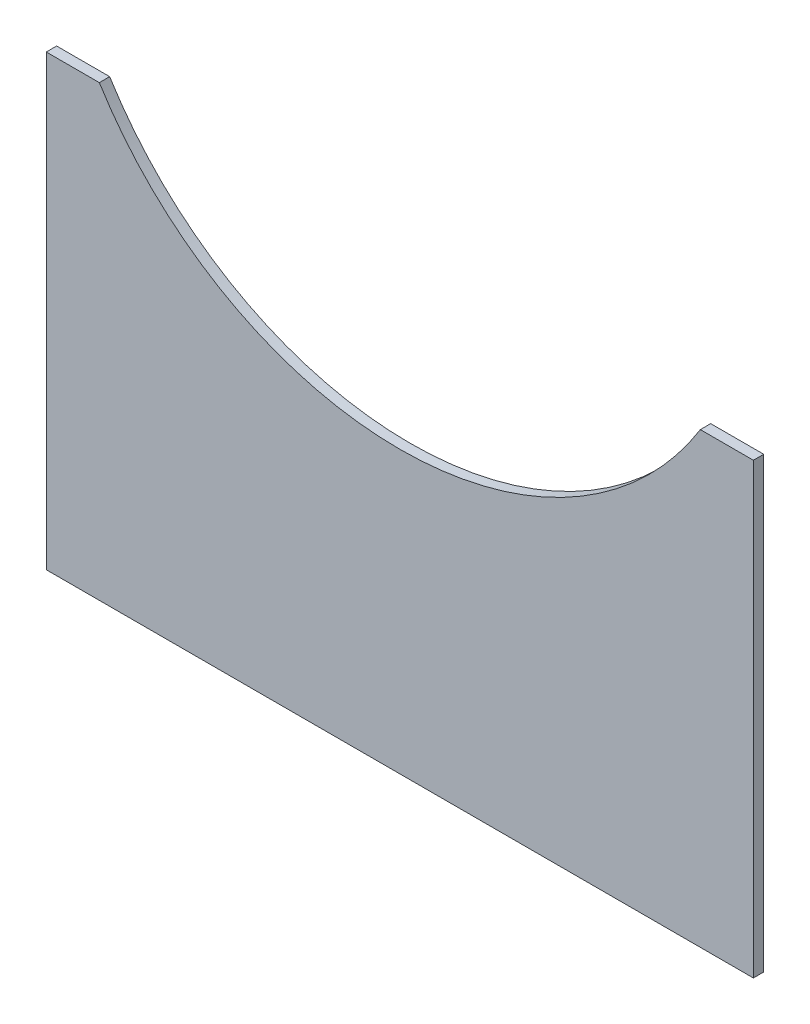
ISO-10303-21;
HEADER;
FILE_DESCRIPTION(('STEP AP214'),'2;1');
FILE_NAME('part.step','',(''),(''),'','','');
FILE_SCHEMA(('AUTOMOTIVE_DESIGN { 1 0 10303 214 1 1 1 1 }'));
ENDSEC;
DATA;
#1=APPLICATION_CONTEXT('core data for automotive mechanical design processes');
#2=APPLICATION_PROTOCOL_DEFINITION('international standard','automotive_design',2000,#1);
#3=PRODUCT_CONTEXT('',#1,'mechanical');
#4=PRODUCT('Part','Part','',(#3));
#5=PRODUCT_RELATED_PRODUCT_CATEGORY('part','',(#4));
#6=PRODUCT_DEFINITION_FORMATION('','',#4);
#7=PRODUCT_DEFINITION_CONTEXT('part definition',#1,'design');
#8=PRODUCT_DEFINITION('design','',#6,#7);
#9=PRODUCT_DEFINITION_SHAPE('','',#8);
#10=(LENGTH_UNIT() NAMED_UNIT(*) SI_UNIT(.MILLI.,.METRE.));
#11=(NAMED_UNIT(*) PLANE_ANGLE_UNIT() SI_UNIT($,.RADIAN.));
#12=(NAMED_UNIT(*) SI_UNIT($,.STERADIAN.) SOLID_ANGLE_UNIT());
#13=UNCERTAINTY_MEASURE_WITH_UNIT(LENGTH_MEASURE(1.E-05),#10,'distance_accuracy_value','');
#14=(GEOMETRIC_REPRESENTATION_CONTEXT(3) GLOBAL_UNCERTAINTY_ASSIGNED_CONTEXT((#13)) GLOBAL_UNIT_ASSIGNED_CONTEXT((#10,
#11,#12)) REPRESENTATION_CONTEXT('',''));
#15=CARTESIAN_POINT('',(0.,0.,0.));
#16=DIRECTION('',(0.,0.,1.));
#17=DIRECTION('',(1.,0.,0.));
#18=AXIS2_PLACEMENT_3D('',#15,#16,#17);
#19=CARTESIAN_POINT('',(-51.25,0.,0.75));
#20=DIRECTION('',(1.,0.,0.));
#21=DIRECTION('',(0.,0.,-1.));
#22=AXIS2_PLACEMENT_3D('',#19,#20,#21);
#23=PLANE('',#22);
#24=DIRECTION('',(0.,-1.,0.));
#25=VECTOR('',#24,1.);
#26=CARTESIAN_POINT('',(-51.25,0.,-0.75));
#27=LINE('',#26,#25);
#28=CARTESIAN_POINT('',(-51.25,65.,-0.75));
#29=VERTEX_POINT('',#28);
#30=CARTESIAN_POINT('',(-51.25,0.,-0.75));
#31=VERTEX_POINT('',#30);
#32=EDGE_CURVE('E125',#29,#31,#27,.T.);
#33=ORIENTED_EDGE('',*,*,#32,.T.);
#34=DIRECTION('',(0.,0.,-1.));
#35=VECTOR('',#34,1.);
#36=CARTESIAN_POINT('',(-51.25,0.,0.75));
#37=LINE('',#36,#35);
#38=CARTESIAN_POINT('',(-51.25,0.,0.75));
#39=VERTEX_POINT('',#38);
#40=EDGE_CURVE('E11',#39,#31,#37,.T.);
#41=ORIENTED_EDGE('',*,*,#40,.F.);
#42=DIRECTION('',(0.,-1.,0.));
#43=VECTOR('',#42,1.);
#44=CARTESIAN_POINT('',(-51.25,0.,0.75));
#45=LINE('',#44,#43);
#46=CARTESIAN_POINT('',(-51.25,65.,0.75));
#47=VERTEX_POINT('',#46);
#48=EDGE_CURVE('E137',#47,#39,#45,.T.);
#49=ORIENTED_EDGE('',*,*,#48,.F.);
#50=DIRECTION('',(0.,0.,-1.));
#51=VECTOR('',#50,1.);
#52=CARTESIAN_POINT('',(-51.25,65.,0.75));
#53=LINE('',#52,#51);
#54=EDGE_CURVE('E121',#47,#29,#53,.T.);
#55=ORIENTED_EDGE('',*,*,#54,.T.);
#56=EDGE_LOOP('',(#33,#41,#49,#55));
#57=FACE_BOUND('',#56,.T.);
#58=ADVANCED_FACE('F39',(#57),#23,.F.);
#59=CARTESIAN_POINT('',(51.25,0.,0.75));
#60=DIRECTION('',(0.,1.,0.));
#61=DIRECTION('',(0.,0.,1.));
#62=AXIS2_PLACEMENT_3D('',#59,#60,#61);
#63=PLANE('',#62);
#64=DIRECTION('',(1.,0.,0.));
#65=VECTOR('',#64,1.);
#66=CARTESIAN_POINT('',(51.25,0.,-0.75));
#67=LINE('',#66,#65);
#68=CARTESIAN_POINT('',(51.25,0.,-0.75));
#69=VERTEX_POINT('',#68);
#70=EDGE_CURVE('E128',#31,#69,#67,.T.);
#71=ORIENTED_EDGE('',*,*,#70,.T.);
#72=DIRECTION('',(0.,0.,-1.));
#73=VECTOR('',#72,1.);
#74=CARTESIAN_POINT('',(51.25,0.,0.75));
#75=LINE('',#74,#73);
#76=CARTESIAN_POINT('',(51.25,0.,0.75));
#77=VERTEX_POINT('',#76);
#78=EDGE_CURVE('E47',#77,#69,#75,.T.);
#79=ORIENTED_EDGE('',*,*,#78,.F.);
#80=DIRECTION('',(1.,0.,0.));
#81=VECTOR('',#80,1.);
#82=CARTESIAN_POINT('',(51.25,0.,0.75));
#83=LINE('',#82,#81);
#84=EDGE_CURVE('E93',#39,#77,#83,.T.);
#85=ORIENTED_EDGE('',*,*,#84,.F.);
#86=ORIENTED_EDGE('',*,*,#40,.T.);
#87=EDGE_LOOP('',(#71,#79,#85,#86));
#88=FACE_BOUND('',#87,.T.);
#89=ADVANCED_FACE('F163',(#88),#63,.F.);
#90=CARTESIAN_POINT('',(51.25,0.,0.75));
#91=DIRECTION('',(-1.,0.,0.));
#92=DIRECTION('',(0.,-1.,0.));
#93=AXIS2_PLACEMENT_3D('',#90,#91,#92);
#94=PLANE('',#93);
#95=DIRECTION('',(0.,1.,0.));
#96=VECTOR('',#95,1.);
#97=CARTESIAN_POINT('',(51.25,0.,-0.75));
#98=LINE('',#97,#96);
#99=CARTESIAN_POINT('',(51.25,65.,-0.75));
#100=VERTEX_POINT('',#99);
#101=EDGE_CURVE('E131',#69,#100,#98,.T.);
#102=ORIENTED_EDGE('',*,*,#101,.T.);
#103=DIRECTION('',(0.,0.,-1.));
#104=VECTOR('',#103,1.);
#105=CARTESIAN_POINT('',(51.25,65.,0.75));
#106=LINE('',#105,#104);
#107=CARTESIAN_POINT('',(51.25,65.,0.75));
#108=VERTEX_POINT('',#107);
#109=EDGE_CURVE('E116',#108,#100,#106,.T.);
#110=ORIENTED_EDGE('',*,*,#109,.F.);
#111=DIRECTION('',(0.,1.,0.));
#112=VECTOR('',#111,1.);
#113=CARTESIAN_POINT('',(51.25,0.,0.75));
#114=LINE('',#113,#112);
#115=EDGE_CURVE('E107',#77,#108,#114,.T.);
#116=ORIENTED_EDGE('',*,*,#115,.F.);
#117=ORIENTED_EDGE('',*,*,#78,.T.);
#118=EDGE_LOOP('',(#102,#110,#116,#117));
#119=FACE_BOUND('',#118,.T.);
#120=ADVANCED_FACE('F145',(#119),#94,.F.);
#121=CARTESIAN_POINT('',(51.25,65.,0.75));
#122=DIRECTION('',(0.,-1.,0.));
#123=DIRECTION('',(1.,0.,0.));
#124=AXIS2_PLACEMENT_3D('',#121,#122,#123);
#125=PLANE('',#124);
#126=DIRECTION('',(-1.,0.,0.));
#127=VECTOR('',#126,1.);
#128=CARTESIAN_POINT('',(51.25,65.,-0.75));
#129=LINE('',#128,#127);
#130=CARTESIAN_POINT('',(43.5610204196366,65.,-0.75));
#131=VERTEX_POINT('',#130);
#132=EDGE_CURVE('E115',#100,#131,#129,.T.);
#133=ORIENTED_EDGE('',*,*,#132,.T.);
#134=DIRECTION('',(0.,0.,-1.));
#135=VECTOR('',#134,1.);
#136=CARTESIAN_POINT('',(43.5610204196366,65.,0.75));
#137=LINE('',#136,#135);
#138=CARTESIAN_POINT('',(43.5610204196366,65.,0.75));
#139=VERTEX_POINT('',#138);
#140=EDGE_CURVE('E112',#139,#131,#137,.T.);
#141=ORIENTED_EDGE('',*,*,#140,.F.);
#142=DIRECTION('',(-1.,0.,0.));
#143=VECTOR('',#142,1.);
#144=CARTESIAN_POINT('',(51.25,65.,0.75));
#145=LINE('',#144,#143);
#146=EDGE_CURVE('E101',#108,#139,#145,.T.);
#147=ORIENTED_EDGE('',*,*,#146,.F.);
#148=ORIENTED_EDGE('',*,*,#109,.T.);
#149=EDGE_LOOP('',(#133,#141,#147,#148));
#150=FACE_BOUND('',#149,.T.);
#151=ADVANCED_FACE('F113',(#150),#125,.F.);
#152=CARTESIAN_POINT('',(0.,92.,0.75));
#153=DIRECTION('',(0.,0.,-1.));
#154=DIRECTION('',(-1.,0.,0.));
#155=AXIS2_PLACEMENT_3D('',#152,#153,#154);
#156=CYLINDRICAL_SURFACE('',#155,51.25);
#157=CARTESIAN_POINT('',(0.,92.,-0.75));
#158=DIRECTION('',(0.,0.,-1.));
#159=DIRECTION('',(1.,0.,0.));
#160=AXIS2_PLACEMENT_3D('',#157,#158,#159);
#161=CIRCLE('',#160,51.25);
#162=CARTESIAN_POINT('',(-43.5610204196366,65.,-0.75));
#163=VERTEX_POINT('',#162);
#164=EDGE_CURVE('E79',#131,#163,#161,.T.);
#165=ORIENTED_EDGE('',*,*,#164,.T.);
#166=DIRECTION('',(0.,0.,-1.));
#167=VECTOR('',#166,1.);
#168=CARTESIAN_POINT('',(-43.5610204196366,65.,0.75));
#169=LINE('',#168,#167);
#170=CARTESIAN_POINT('',(-43.5610204196366,65.,0.75));
#171=VERTEX_POINT('',#170);
#172=EDGE_CURVE('E117',#171,#163,#169,.T.);
#173=ORIENTED_EDGE('',*,*,#172,.F.);
#174=CARTESIAN_POINT('',(0.,92.,0.75));
#175=DIRECTION('',(0.,0.,-1.));
#176=DIRECTION('',(1.,0.,0.));
#177=AXIS2_PLACEMENT_3D('',#174,#175,#176);
#178=CIRCLE('',#177,51.25);
#179=EDGE_CURVE('E105',#139,#171,#178,.T.);
#180=ORIENTED_EDGE('',*,*,#179,.F.);
#181=ORIENTED_EDGE('',*,*,#140,.T.);
#182=EDGE_LOOP('',(#165,#173,#180,#181));
#183=FACE_BOUND('',#182,.T.);
#184=ADVANCED_FACE('F119',(#183),#156,.F.);
#185=CARTESIAN_POINT('',(-51.25,65.,0.75));
#186=DIRECTION('',(0.,-1.,0.));
#187=DIRECTION('',(1.,0.,0.));
#188=AXIS2_PLACEMENT_3D('',#185,#186,#187);
#189=PLANE('',#188);
#190=DIRECTION('',(-1.,0.,0.));
#191=VECTOR('',#190,1.);
#192=CARTESIAN_POINT('',(-51.25,65.,-0.75));
#193=LINE('',#192,#191);
#194=EDGE_CURVE('E85',#163,#29,#193,.T.);
#195=ORIENTED_EDGE('',*,*,#194,.T.);
#196=ORIENTED_EDGE('',*,*,#54,.F.);
#197=DIRECTION('',(-1.,0.,0.));
#198=VECTOR('',#197,1.);
#199=CARTESIAN_POINT('',(-51.25,65.,0.75));
#200=LINE('',#199,#198);
#201=EDGE_CURVE('E55',#171,#47,#200,.T.);
#202=ORIENTED_EDGE('',*,*,#201,.F.);
#203=ORIENTED_EDGE('',*,*,#172,.T.);
#204=EDGE_LOOP('',(#195,#196,#202,#203));
#205=FACE_BOUND('',#204,.T.);
#206=ADVANCED_FACE('F152',(#205),#189,.F.);
#207=CARTESIAN_POINT('',(0.,92.,0.75));
#208=DIRECTION('',(0.,0.,1.));
#209=DIRECTION('',(1.,0.,0.));
#210=AXIS2_PLACEMENT_3D('',#207,#208,#209);
#211=PLANE('',#210);
#212=ORIENTED_EDGE('',*,*,#48,.T.);
#213=ORIENTED_EDGE('',*,*,#84,.T.);
#214=ORIENTED_EDGE('',*,*,#115,.T.);
#215=ORIENTED_EDGE('',*,*,#146,.T.);
#216=ORIENTED_EDGE('',*,*,#179,.T.);
#217=ORIENTED_EDGE('',*,*,#201,.T.);
#218=EDGE_LOOP('',(#212,#213,#214,#215,#216,#217));
#219=FACE_BOUND('',#218,.T.);
#220=ADVANCED_FACE('F103',(#219),#211,.T.);
#221=CARTESIAN_POINT('',(0.,92.,-0.75));
#222=DIRECTION('',(0.,0.,1.));
#223=DIRECTION('',(1.,0.,0.));
#224=AXIS2_PLACEMENT_3D('',#221,#222,#223);
#225=PLANE('',#224);
#226=ORIENTED_EDGE('',*,*,#32,.F.);
#227=ORIENTED_EDGE('',*,*,#194,.F.);
#228=ORIENTED_EDGE('',*,*,#164,.F.);
#229=ORIENTED_EDGE('',*,*,#132,.F.);
#230=ORIENTED_EDGE('',*,*,#101,.F.);
#231=ORIENTED_EDGE('',*,*,#70,.F.);
#232=EDGE_LOOP('',(#226,#227,#228,#229,#230,#231));
#233=FACE_BOUND('',#232,.T.);
#234=ADVANCED_FACE('F148',(#233),#225,.F.);
#235=CLOSED_SHELL('',(#58,#89,#120,#151,#184,#206,#220,#234));
#236=MANIFOLD_SOLID_BREP('B2',#235);
#237=ADVANCED_BREP_SHAPE_REPRESENTATION('',(#18,#236),#14);
#238=SHAPE_DEFINITION_REPRESENTATION(#9,#237);
ENDSEC;
END-ISO-10303-21;
